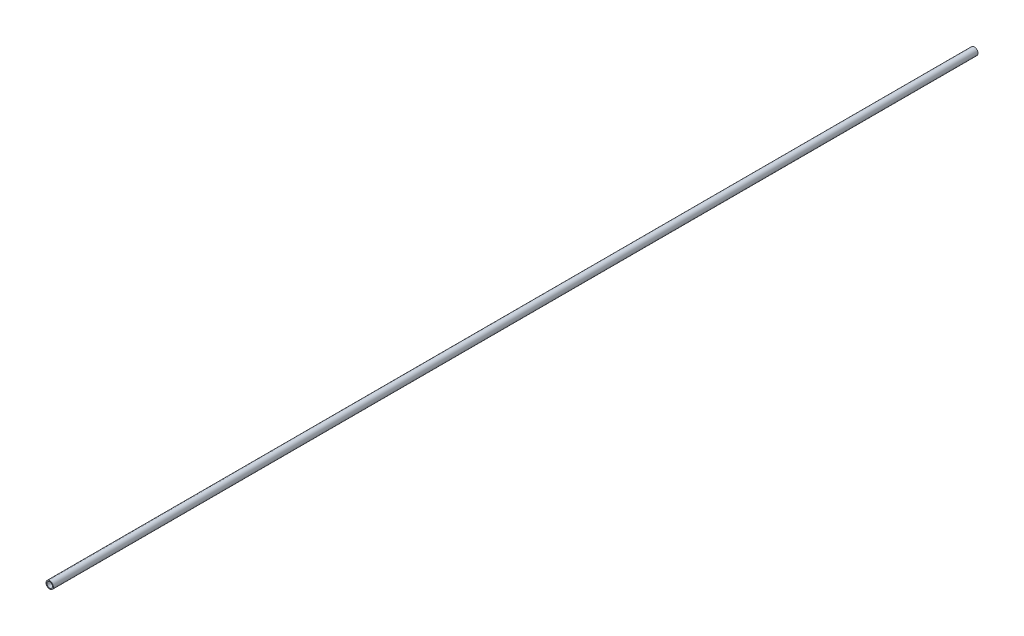
ISO-10303-21;
HEADER;
FILE_DESCRIPTION(('STEP AP214'),'2;1');
FILE_NAME('part.step','',(''),(''),'','','');
FILE_SCHEMA(('AUTOMOTIVE_DESIGN { 1 0 10303 214 1 1 1 1 }'));
ENDSEC;
DATA;
#1=APPLICATION_CONTEXT('core data for automotive mechanical design processes');
#2=APPLICATION_PROTOCOL_DEFINITION('international standard','automotive_design',2000,#1);
#3=PRODUCT_CONTEXT('',#1,'mechanical');
#4=PRODUCT('Part','Part','',(#3));
#5=PRODUCT_RELATED_PRODUCT_CATEGORY('part','',(#4));
#6=PRODUCT_DEFINITION_FORMATION('','',#4);
#7=PRODUCT_DEFINITION_CONTEXT('part definition',#1,'design');
#8=PRODUCT_DEFINITION('design','',#6,#7);
#9=PRODUCT_DEFINITION_SHAPE('','',#8);
#10=(LENGTH_UNIT() NAMED_UNIT(*) SI_UNIT(.MILLI.,.METRE.));
#11=(NAMED_UNIT(*) PLANE_ANGLE_UNIT() SI_UNIT($,.RADIAN.));
#12=(NAMED_UNIT(*) SI_UNIT($,.STERADIAN.) SOLID_ANGLE_UNIT());
#13=UNCERTAINTY_MEASURE_WITH_UNIT(LENGTH_MEASURE(1.E-05),#10,'distance_accuracy_value','');
#14=(GEOMETRIC_REPRESENTATION_CONTEXT(3) GLOBAL_UNCERTAINTY_ASSIGNED_CONTEXT((#13)) GLOBAL_UNIT_ASSIGNED_CONTEXT((#10,
#11,#12)) REPRESENTATION_CONTEXT('',''));
#15=CARTESIAN_POINT('',(0.,0.,0.));
#16=DIRECTION('',(0.,0.,1.));
#17=DIRECTION('',(1.,0.,0.));
#18=AXIS2_PLACEMENT_3D('',#15,#16,#17);
#19=CARTESIAN_POINT('',(0.,0.,500.));
#20=DIRECTION('',(0.,0.,1.));
#21=DIRECTION('',(1.,0.,0.));
#22=AXIS2_PLACEMENT_3D('',#19,#20,#21);
#23=PLANE('',#22);
#24=CARTESIAN_POINT('',(0.,0.,500.));
#25=DIRECTION('',(0.,0.,1.));
#26=DIRECTION('',(1.,0.,0.));
#27=AXIS2_PLACEMENT_3D('',#24,#25,#26);
#28=CIRCLE('',#27,4.);
#29=CARTESIAN_POINT('',(4.,0.,500.));
#30=VERTEX_POINT('',#29);
#31=EDGE_CURVE('E10',#30,#30,#28,.T.);
#32=ORIENTED_EDGE('',*,*,#31,.T.);
#33=EDGE_LOOP('',(#32));
#34=FACE_BOUND('',#33,.T.);
#35=CARTESIAN_POINT('',(0.,0.,500.));
#36=DIRECTION('',(0.,0.,1.));
#37=DIRECTION('',(1.,0.,0.));
#38=AXIS2_PLACEMENT_3D('',#35,#36,#37);
#39=CIRCLE('',#38,3.);
#40=CARTESIAN_POINT('',(3.,0.,500.));
#41=VERTEX_POINT('',#40);
#42=EDGE_CURVE('E44',#41,#41,#39,.T.);
#43=ORIENTED_EDGE('',*,*,#42,.F.);
#44=EDGE_LOOP('',(#43));
#45=FACE_BOUND('',#44,.T.);
#46=ADVANCED_FACE('F33',(#34,#45),#23,.T.);
#47=CARTESIAN_POINT('',(0.,0.,-500.));
#48=DIRECTION('',(0.,0.,1.));
#49=DIRECTION('',(1.,0.,0.));
#50=AXIS2_PLACEMENT_3D('',#47,#48,#49);
#51=PLANE('',#50);
#52=CARTESIAN_POINT('',(0.,0.,-500.));
#53=DIRECTION('',(0.,0.,1.));
#54=DIRECTION('',(1.,0.,0.));
#55=AXIS2_PLACEMENT_3D('',#52,#53,#54);
#56=CIRCLE('',#55,4.);
#57=CARTESIAN_POINT('',(4.,0.,-500.));
#58=VERTEX_POINT('',#57);
#59=EDGE_CURVE('E37',#58,#58,#56,.T.);
#60=ORIENTED_EDGE('',*,*,#59,.F.);
#61=EDGE_LOOP('',(#60));
#62=FACE_BOUND('',#61,.T.);
#63=CARTESIAN_POINT('',(0.,0.,-500.));
#64=DIRECTION('',(0.,0.,1.));
#65=DIRECTION('',(1.,0.,0.));
#66=AXIS2_PLACEMENT_3D('',#63,#64,#65);
#67=CIRCLE('',#66,3.);
#68=CARTESIAN_POINT('',(3.,0.,-500.));
#69=VERTEX_POINT('',#68);
#70=EDGE_CURVE('E46',#69,#69,#67,.T.);
#71=ORIENTED_EDGE('',*,*,#70,.T.);
#72=EDGE_LOOP('',(#71));
#73=FACE_BOUND('',#72,.T.);
#74=ADVANCED_FACE('F56',(#62,#73),#51,.F.);
#75=CARTESIAN_POINT('',(0.,0.,500.));
#76=DIRECTION('',(0.,0.,-1.));
#77=DIRECTION('',(-1.,0.,0.));
#78=AXIS2_PLACEMENT_3D('',#75,#76,#77);
#79=CYLINDRICAL_SURFACE('',#78,4.);
#80=ORIENTED_EDGE('',*,*,#31,.F.);
#81=EDGE_LOOP('',(#80));
#82=FACE_BOUND('',#81,.T.);
#83=ORIENTED_EDGE('',*,*,#59,.T.);
#84=EDGE_LOOP('',(#83));
#85=FACE_BOUND('',#84,.T.);
#86=ADVANCED_FACE('F35',(#82,#85),#79,.T.);
#87=CARTESIAN_POINT('',(0.,0.,500.));
#88=DIRECTION('',(0.,0.,-1.));
#89=DIRECTION('',(-1.,0.,0.));
#90=AXIS2_PLACEMENT_3D('',#87,#88,#89);
#91=CYLINDRICAL_SURFACE('',#90,3.);
#92=ORIENTED_EDGE('',*,*,#42,.T.);
#93=EDGE_LOOP('',(#92));
#94=FACE_BOUND('',#93,.T.);
#95=ORIENTED_EDGE('',*,*,#70,.F.);
#96=EDGE_LOOP('',(#95));
#97=FACE_BOUND('',#96,.T.);
#98=ADVANCED_FACE('F52',(#94,#97),#91,.F.);
#99=CLOSED_SHELL('',(#46,#74,#86,#98));
#100=MANIFOLD_SOLID_BREP('B2',#99);
#101=ADVANCED_BREP_SHAPE_REPRESENTATION('',(#18,#100),#14);
#102=SHAPE_DEFINITION_REPRESENTATION(#9,#101);
ENDSEC;
END-ISO-10303-21;
